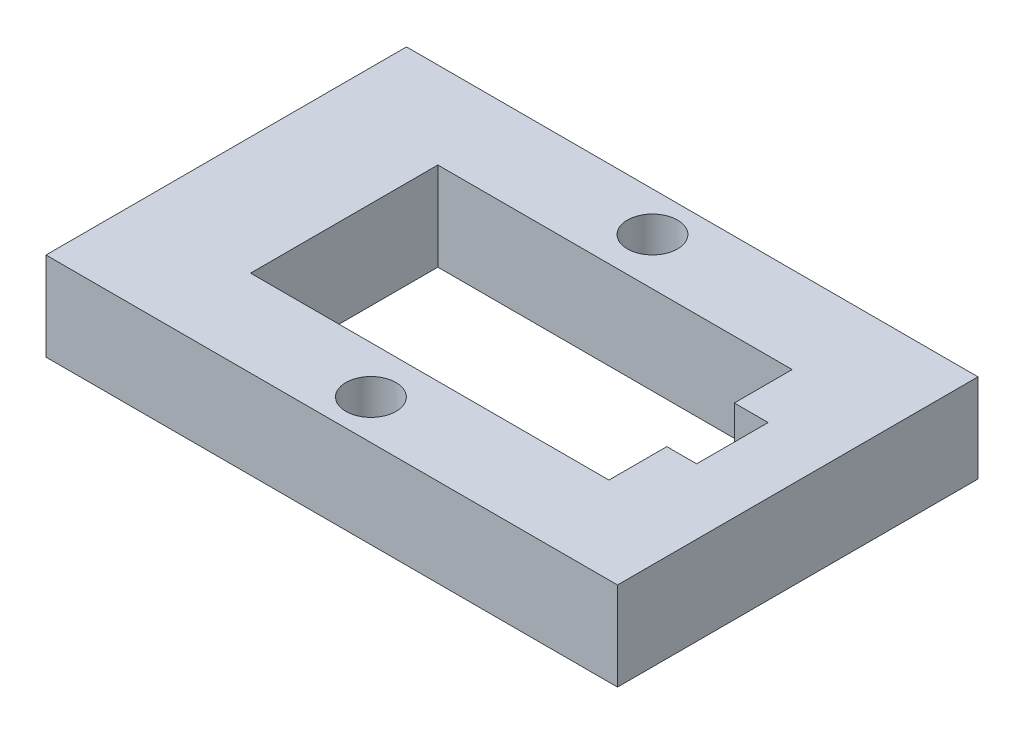
ISO-10303-21;
HEADER;
FILE_DESCRIPTION(('STEP AP214'),'2;1');
FILE_NAME('part.step','',(''),(''),'','','');
FILE_SCHEMA(('AUTOMOTIVE_DESIGN { 1 0 10303 214 1 1 1 1 }'));
ENDSEC;
DATA;
#1=APPLICATION_CONTEXT('core data for automotive mechanical design processes');
#2=APPLICATION_PROTOCOL_DEFINITION('international standard','automotive_design',2000,#1);
#3=PRODUCT_CONTEXT('',#1,'mechanical');
#4=PRODUCT('Part','Part','',(#3));
#5=PRODUCT_RELATED_PRODUCT_CATEGORY('part','',(#4));
#6=PRODUCT_DEFINITION_FORMATION('','',#4);
#7=PRODUCT_DEFINITION_CONTEXT('part definition',#1,'design');
#8=PRODUCT_DEFINITION('design','',#6,#7);
#9=PRODUCT_DEFINITION_SHAPE('','',#8);
#10=(LENGTH_UNIT() NAMED_UNIT(*) SI_UNIT(.MILLI.,.METRE.));
#11=(NAMED_UNIT(*) PLANE_ANGLE_UNIT() SI_UNIT($,.RADIAN.));
#12=(NAMED_UNIT(*) SI_UNIT($,.STERADIAN.) SOLID_ANGLE_UNIT());
#13=UNCERTAINTY_MEASURE_WITH_UNIT(LENGTH_MEASURE(1.E-05),#10,'distance_accuracy_value','');
#14=(GEOMETRIC_REPRESENTATION_CONTEXT(3) GLOBAL_UNCERTAINTY_ASSIGNED_CONTEXT((#13)) GLOBAL_UNIT_ASSIGNED_CONTEXT((#10,
#11,#12)) REPRESENTATION_CONTEXT('',''));
#15=CARTESIAN_POINT('',(0.,0.,0.));
#16=DIRECTION('',(0.,0.,1.));
#17=DIRECTION('',(1.,0.,0.));
#18=AXIS2_PLACEMENT_3D('',#15,#16,#17);
#19=CARTESIAN_POINT('',(0.,3.,0.));
#20=DIRECTION('',(0.,1.,0.));
#21=DIRECTION('',(0.,0.,1.));
#22=AXIS2_PLACEMENT_3D('',#19,#20,#21);
#23=PLANE('',#22);
#24=CARTESIAN_POINT('',(-1.2726821184778,3.,-10.9543613464888));
#25=DIRECTION('',(0.,1.,0.));
#26=DIRECTION('',(0.,0.,1.));
#27=AXIS2_PLACEMENT_3D('',#24,#25,#26);
#28=CIRCLE('',#27,1.7);
#29=CARTESIAN_POINT('',(-1.2726821184778,3.,-9.25436134648878));
#30=VERTEX_POINT('',#29);
#31=EDGE_CURVE('E176',#30,#30,#28,.T.);
#32=ORIENTED_EDGE('',*,*,#31,.F.);
#33=EDGE_LOOP('',(#32));
#34=FACE_BOUND('',#33,.T.);
#35=DIRECTION('',(0.,0.,1.));
#36=VECTOR('',#35,1.);
#37=CARTESIAN_POINT('',(-20.6290016384778,3.,-13.6320813464888));
#38=LINE('',#37,#36);
#39=CARTESIAN_POINT('',(-20.6290016384778,3.,-13.6320813464888));
#40=VERTEX_POINT('',#39);
#41=CARTESIAN_POINT('',(-20.6290016384778,3.,10.8109486535112));
#42=VERTEX_POINT('',#41);
#43=EDGE_CURVE('E220',#40,#42,#38,.T.);
#44=ORIENTED_EDGE('',*,*,#43,.T.);
#45=DIRECTION('',(1.,0.,0.));
#46=VECTOR('',#45,1.);
#47=CARTESIAN_POINT('',(-20.6290016384778,3.,10.8109486535112));
#48=LINE('',#47,#46);
#49=CARTESIAN_POINT('',(18.1229383615222,3.,10.8109486535112));
#50=VERTEX_POINT('',#49);
#51=EDGE_CURVE('E224',#42,#50,#48,.T.);
#52=ORIENTED_EDGE('',*,*,#51,.T.);
#53=DIRECTION('',(0.,0.,-1.));
#54=VECTOR('',#53,1.);
#55=CARTESIAN_POINT('',(18.1229383615222,3.,-13.6320813464888));
#56=LINE('',#55,#54);
#57=CARTESIAN_POINT('',(18.1229383615222,3.,-13.6320813464888));
#58=VERTEX_POINT('',#57);
#59=EDGE_CURVE('E228',#50,#58,#56,.T.);
#60=ORIENTED_EDGE('',*,*,#59,.T.);
#61=DIRECTION('',(-1.,0.,0.));
#62=VECTOR('',#61,1.);
#63=CARTESIAN_POINT('',(-20.6290016384778,3.,-13.6320813464888));
#64=LINE('',#63,#62);
#65=EDGE_CURVE('E231',#58,#40,#64,.T.);
#66=ORIENTED_EDGE('',*,*,#65,.T.);
#67=EDGE_LOOP('',(#44,#52,#60,#66));
#68=FACE_BOUND('',#67,.T.);
#69=DIRECTION('',(1.,0.,0.));
#70=VECTOR('',#69,1.);
#71=CARTESIAN_POINT('',(11.6709983615222,3.,4.94094865351122));
#72=LINE('',#71,#70);
#73=CARTESIAN_POINT('',(-12.6290016384778,3.,4.94094865351122));
#74=VERTEX_POINT('',#73);
#75=CARTESIAN_POINT('',(11.6709983615222,3.,4.94094865351122));
#76=VERTEX_POINT('',#75);
#77=EDGE_CURVE('E137',#74,#76,#72,.T.);
#78=ORIENTED_EDGE('',*,*,#77,.F.);
#79=DIRECTION('',(0.,0.,1.));
#80=VECTOR('',#79,1.);
#81=CARTESIAN_POINT('',(-12.6290016384778,3.,4.94094865351122));
#82=LINE('',#81,#80);
#83=CARTESIAN_POINT('',(-12.6290016384778,3.,-7.75905134648878));
#84=VERTEX_POINT('',#83);
#85=EDGE_CURVE('E128',#84,#74,#82,.T.);
#86=ORIENTED_EDGE('',*,*,#85,.F.);
#87=DIRECTION('',(-1.,0.,0.));
#88=VECTOR('',#87,1.);
#89=CARTESIAN_POINT('',(-12.6290016384778,3.,-7.75905134648878));
#90=LINE('',#89,#88);
#91=CARTESIAN_POINT('',(11.3955588266385,3.,-7.75905134648878));
#92=VERTEX_POINT('',#91);
#93=EDGE_CURVE('E171',#92,#84,#90,.T.);
#94=ORIENTED_EDGE('',*,*,#93,.F.);
#95=DIRECTION('',(0.,0.,-1.));
#96=VECTOR('',#95,1.);
#97=CARTESIAN_POINT('',(11.3955588266385,3.,-7.75905134648878));
#98=LINE('',#97,#96);
#99=CARTESIAN_POINT('',(11.3955588266385,3.,-3.83394634648878));
#100=VERTEX_POINT('',#99);
#101=EDGE_CURVE('E168',#100,#92,#98,.T.);
#102=ORIENTED_EDGE('',*,*,#101,.F.);
#103=DIRECTION('',(-1.,0.,0.));
#104=VECTOR('',#103,1.);
#105=CARTESIAN_POINT('',(11.3955588266385,3.,-3.83394634648878));
#106=LINE('',#105,#104);
#107=CARTESIAN_POINT('',(13.6929483615222,3.,-3.83394634648878));
#108=VERTEX_POINT('',#107);
#109=EDGE_CURVE('E165',#108,#100,#106,.T.);
#110=ORIENTED_EDGE('',*,*,#109,.F.);
#111=DIRECTION('',(0.,0.,-1.));
#112=VECTOR('',#111,1.);
#113=CARTESIAN_POINT('',(13.6929483615222,3.,-3.83394634648878));
#114=LINE('',#113,#112);
#115=CARTESIAN_POINT('',(13.6929483615222,3.,1.01584365351122));
#116=VERTEX_POINT('',#115);
#117=EDGE_CURVE('E162',#116,#108,#114,.T.);
#118=ORIENTED_EDGE('',*,*,#117,.F.);
#119=DIRECTION('',(1.,0.,0.));
#120=VECTOR('',#119,1.);
#121=CARTESIAN_POINT('',(13.6929483615222,3.,1.01584365351122));
#122=LINE('',#121,#120);
#123=CARTESIAN_POINT('',(11.6709983615222,3.,1.01584365351122));
#124=VERTEX_POINT('',#123);
#125=EDGE_CURVE('E156',#124,#116,#122,.T.);
#126=ORIENTED_EDGE('',*,*,#125,.F.);
#127=DIRECTION('',(0.,0.,-1.));
#128=VECTOR('',#127,1.);
#129=CARTESIAN_POINT('',(11.6709983615222,3.,1.01584365351122));
#130=LINE('',#129,#128);
#131=EDGE_CURVE('E152',#76,#124,#130,.T.);
#132=ORIENTED_EDGE('',*,*,#131,.F.);
#133=EDGE_LOOP('',(#78,#86,#94,#102,#110,#118,#126,#132));
#134=FACE_BOUND('',#133,.T.);
#135=CARTESIAN_POINT('',(-1.27706163847779,3.,8.13094865351122));
#136=DIRECTION('',(0.,1.,0.));
#137=DIRECTION('',(0.,0.,1.));
#138=AXIS2_PLACEMENT_3D('',#135,#136,#137);
#139=CIRCLE('',#138,1.7);
#140=CARTESIAN_POINT('',(-1.27706163847779,3.,9.83094865351122));
#141=VERTEX_POINT('',#140);
#142=EDGE_CURVE('E337',#141,#141,#139,.T.);
#143=ORIENTED_EDGE('',*,*,#142,.F.);
#144=EDGE_LOOP('',(#143));
#145=FACE_BOUND('',#144,.T.);
#146=ADVANCED_FACE('F38',(#34,#68,#134,#145),#23,.T.);
#147=CARTESIAN_POINT('',(0.,-3.,0.));
#148=DIRECTION('',(0.,1.,0.));
#149=DIRECTION('',(0.,0.,1.));
#150=AXIS2_PLACEMENT_3D('',#147,#148,#149);
#151=PLANE('',#150);
#152=DIRECTION('',(0.,0.,1.));
#153=VECTOR('',#152,1.);
#154=CARTESIAN_POINT('',(-20.6290016384778,-3.,-13.6320813464888));
#155=LINE('',#154,#153);
#156=CARTESIAN_POINT('',(-20.6290016384778,-3.,-13.6320813464888));
#157=VERTEX_POINT('',#156);
#158=CARTESIAN_POINT('',(-20.6290016384778,-3.,10.8109486535112));
#159=VERTEX_POINT('',#158);
#160=EDGE_CURVE('E146',#157,#159,#155,.T.);
#161=ORIENTED_EDGE('',*,*,#160,.F.);
#162=DIRECTION('',(-1.,0.,0.));
#163=VECTOR('',#162,1.);
#164=CARTESIAN_POINT('',(-20.6290016384778,-3.,-13.6320813464888));
#165=LINE('',#164,#163);
#166=CARTESIAN_POINT('',(18.1229383615222,-3.,-13.6320813464888));
#167=VERTEX_POINT('',#166);
#168=EDGE_CURVE('E225',#167,#157,#165,.T.);
#169=ORIENTED_EDGE('',*,*,#168,.F.);
#170=DIRECTION('',(0.,0.,-1.));
#171=VECTOR('',#170,1.);
#172=CARTESIAN_POINT('',(18.1229383615222,-3.,-13.6320813464888));
#173=LINE('',#172,#171);
#174=CARTESIAN_POINT('',(18.1229383615222,-3.,10.8109486535112));
#175=VERTEX_POINT('',#174);
#176=EDGE_CURVE('E241',#175,#167,#173,.T.);
#177=ORIENTED_EDGE('',*,*,#176,.F.);
#178=DIRECTION('',(1.,0.,0.));
#179=VECTOR('',#178,1.);
#180=CARTESIAN_POINT('',(-20.6290016384778,-3.,10.8109486535112));
#181=LINE('',#180,#179);
#182=EDGE_CURVE('E238',#159,#175,#181,.T.);
#183=ORIENTED_EDGE('',*,*,#182,.F.);
#184=EDGE_LOOP('',(#161,#169,#177,#183));
#185=FACE_BOUND('',#184,.T.);
#186=DIRECTION('',(0.,0.,1.));
#187=VECTOR('',#186,1.);
#188=CARTESIAN_POINT('',(-12.6290016384778,-3.,4.94094865351122));
#189=LINE('',#188,#187);
#190=CARTESIAN_POINT('',(-12.6290016384778,-3.,-7.75905134648878));
#191=VERTEX_POINT('',#190);
#192=CARTESIAN_POINT('',(-12.6290016384778,-3.,4.94094865351122));
#193=VERTEX_POINT('',#192);
#194=EDGE_CURVE('E62',#191,#193,#189,.T.);
#195=ORIENTED_EDGE('',*,*,#194,.T.);
#196=DIRECTION('',(1.,0.,0.));
#197=VECTOR('',#196,1.);
#198=CARTESIAN_POINT('',(11.6709983615222,-3.,4.94094865351122));
#199=LINE('',#198,#197);
#200=CARTESIAN_POINT('',(11.6709983615222,-3.,4.94094865351122));
#201=VERTEX_POINT('',#200);
#202=EDGE_CURVE('E144',#193,#201,#199,.T.);
#203=ORIENTED_EDGE('',*,*,#202,.T.);
#204=DIRECTION('',(0.,0.,-1.));
#205=VECTOR('',#204,1.);
#206=CARTESIAN_POINT('',(11.6709983615222,-3.,1.01584365351122));
#207=LINE('',#206,#205);
#208=CARTESIAN_POINT('',(11.6709983615222,-3.,1.01584365351122));
#209=VERTEX_POINT('',#208);
#210=EDGE_CURVE('E179',#201,#209,#207,.T.);
#211=ORIENTED_EDGE('',*,*,#210,.T.);
#212=DIRECTION('',(1.,0.,0.));
#213=VECTOR('',#212,1.);
#214=CARTESIAN_POINT('',(13.6929483615222,-3.,1.01584365351122));
#215=LINE('',#214,#213);
#216=CARTESIAN_POINT('',(13.6929483615222,-3.,1.01584365351122));
#217=VERTEX_POINT('',#216);
#218=EDGE_CURVE('E183',#209,#217,#215,.T.);
#219=ORIENTED_EDGE('',*,*,#218,.T.);
#220=DIRECTION('',(0.,0.,-1.));
#221=VECTOR('',#220,1.);
#222=CARTESIAN_POINT('',(13.6929483615222,-3.,-3.83394634648878));
#223=LINE('',#222,#221);
#224=CARTESIAN_POINT('',(13.6929483615222,-3.,-3.83394634648878));
#225=VERTEX_POINT('',#224);
#226=EDGE_CURVE('E187',#217,#225,#223,.T.);
#227=ORIENTED_EDGE('',*,*,#226,.T.);
#228=DIRECTION('',(-1.,0.,0.));
#229=VECTOR('',#228,1.);
#230=CARTESIAN_POINT('',(11.3955588266385,-3.,-3.83394634648878));
#231=LINE('',#230,#229);
#232=CARTESIAN_POINT('',(11.3955588266385,-3.,-3.83394634648878));
#233=VERTEX_POINT('',#232);
#234=EDGE_CURVE('E191',#225,#233,#231,.T.);
#235=ORIENTED_EDGE('',*,*,#234,.T.);
#236=DIRECTION('',(0.,0.,-1.));
#237=VECTOR('',#236,1.);
#238=CARTESIAN_POINT('',(11.3955588266385,-3.,-7.75905134648878));
#239=LINE('',#238,#237);
#240=CARTESIAN_POINT('',(11.3955588266385,-3.,-7.75905134648878));
#241=VERTEX_POINT('',#240);
#242=EDGE_CURVE('E195',#233,#241,#239,.T.);
#243=ORIENTED_EDGE('',*,*,#242,.T.);
#244=DIRECTION('',(-1.,0.,0.));
#245=VECTOR('',#244,1.);
#246=CARTESIAN_POINT('',(-12.6290016384778,-3.,-7.75905134648878));
#247=LINE('',#246,#245);
#248=EDGE_CURVE('E138',#241,#191,#247,.T.);
#249=ORIENTED_EDGE('',*,*,#248,.T.);
#250=EDGE_LOOP('',(#195,#203,#211,#219,#227,#235,#243,#249));
#251=FACE_BOUND('',#250,.T.);
#252=CARTESIAN_POINT('',(-1.2726821184778,-3.,-10.9543613464888));
#253=DIRECTION('',(0.,1.,0.));
#254=DIRECTION('',(0.,0.,1.));
#255=AXIS2_PLACEMENT_3D('',#252,#253,#254);
#256=CIRCLE('',#255,1.7);
#257=CARTESIAN_POINT('',(-1.2726821184778,-3.,-9.25436134648878));
#258=VERTEX_POINT('',#257);
#259=EDGE_CURVE('E345',#258,#258,#256,.T.);
#260=ORIENTED_EDGE('',*,*,#259,.T.);
#261=EDGE_LOOP('',(#260));
#262=FACE_BOUND('',#261,.T.);
#263=CARTESIAN_POINT('',(-1.27706163847779,-3.,8.13094865351122));
#264=DIRECTION('',(0.,1.,0.));
#265=DIRECTION('',(0.,0.,1.));
#266=AXIS2_PLACEMENT_3D('',#263,#264,#265);
#267=CIRCLE('',#266,1.7);
#268=CARTESIAN_POINT('',(-1.27706163847779,-3.,9.83094865351122));
#269=VERTEX_POINT('',#268);
#270=EDGE_CURVE('E340',#269,#269,#267,.T.);
#271=ORIENTED_EDGE('',*,*,#270,.T.);
#272=EDGE_LOOP('',(#271));
#273=FACE_BOUND('',#272,.T.);
#274=ADVANCED_FACE('F264',(#185,#251,#262,#273),#151,.F.);
#275=CARTESIAN_POINT('',(-20.6290016384778,3.,-13.6320813464888));
#276=DIRECTION('',(1.,0.,0.));
#277=DIRECTION('',(0.,0.,-1.));
#278=AXIS2_PLACEMENT_3D('',#275,#276,#277);
#279=PLANE('',#278);
#280=ORIENTED_EDGE('',*,*,#160,.T.);
#281=DIRECTION('',(0.,-1.,0.));
#282=VECTOR('',#281,1.);
#283=CARTESIAN_POINT('',(-20.6290016384778,3.,10.8109486535112));
#284=LINE('',#283,#282);
#285=EDGE_CURVE('E11',#42,#159,#284,.T.);
#286=ORIENTED_EDGE('',*,*,#285,.F.);
#287=ORIENTED_EDGE('',*,*,#43,.F.);
#288=DIRECTION('',(0.,-1.,0.));
#289=VECTOR('',#288,1.);
#290=CARTESIAN_POINT('',(-20.6290016384778,3.,-13.6320813464888));
#291=LINE('',#290,#289);
#292=EDGE_CURVE('E234',#40,#157,#291,.T.);
#293=ORIENTED_EDGE('',*,*,#292,.T.);
#294=EDGE_LOOP('',(#280,#286,#287,#293));
#295=FACE_BOUND('',#294,.T.);
#296=ADVANCED_FACE('F40',(#295),#279,.F.);
#297=CARTESIAN_POINT('',(-20.6290016384778,3.,10.8109486535112));
#298=DIRECTION('',(0.,0.,-1.));
#299=DIRECTION('',(-1.,0.,0.));
#300=AXIS2_PLACEMENT_3D('',#297,#298,#299);
#301=PLANE('',#300);
#302=ORIENTED_EDGE('',*,*,#182,.T.);
#303=DIRECTION('',(0.,-1.,0.));
#304=VECTOR('',#303,1.);
#305=CARTESIAN_POINT('',(18.1229383615222,3.,10.8109486535112));
#306=LINE('',#305,#304);
#307=EDGE_CURVE('E47',#50,#175,#306,.T.);
#308=ORIENTED_EDGE('',*,*,#307,.F.);
#309=ORIENTED_EDGE('',*,*,#51,.F.);
#310=ORIENTED_EDGE('',*,*,#285,.T.);
#311=EDGE_LOOP('',(#302,#308,#309,#310));
#312=FACE_BOUND('',#311,.T.);
#313=ADVANCED_FACE('F274',(#312),#301,.F.);
#314=CARTESIAN_POINT('',(18.1229383615222,3.,-13.6320813464888));
#315=DIRECTION('',(-1.,0.,0.));
#316=DIRECTION('',(0.,0.,1.));
#317=AXIS2_PLACEMENT_3D('',#314,#315,#316);
#318=PLANE('',#317);
#319=ORIENTED_EDGE('',*,*,#176,.T.);
#320=DIRECTION('',(0.,-1.,0.));
#321=VECTOR('',#320,1.);
#322=CARTESIAN_POINT('',(18.1229383615222,3.,-13.6320813464888));
#323=LINE('',#322,#321);
#324=EDGE_CURVE('E249',#58,#167,#323,.T.);
#325=ORIENTED_EDGE('',*,*,#324,.F.);
#326=ORIENTED_EDGE('',*,*,#59,.F.);
#327=ORIENTED_EDGE('',*,*,#307,.T.);
#328=EDGE_LOOP('',(#319,#325,#326,#327));
#329=FACE_BOUND('',#328,.T.);
#330=ADVANCED_FACE('F258',(#329),#318,.F.);
#331=CARTESIAN_POINT('',(-20.6290016384778,3.,-13.6320813464888));
#332=DIRECTION('',(0.,0.,1.));
#333=DIRECTION('',(1.,0.,0.));
#334=AXIS2_PLACEMENT_3D('',#331,#332,#333);
#335=PLANE('',#334);
#336=ORIENTED_EDGE('',*,*,#168,.T.);
#337=ORIENTED_EDGE('',*,*,#292,.F.);
#338=ORIENTED_EDGE('',*,*,#65,.F.);
#339=ORIENTED_EDGE('',*,*,#324,.T.);
#340=EDGE_LOOP('',(#336,#337,#338,#339));
#341=FACE_BOUND('',#340,.T.);
#342=ADVANCED_FACE('F268',(#341),#335,.F.);
#343=CARTESIAN_POINT('',(-12.6290016384778,3.,4.94094865351122));
#344=DIRECTION('',(1.,0.,0.));
#345=DIRECTION('',(0.,0.,-1.));
#346=AXIS2_PLACEMENT_3D('',#343,#344,#345);
#347=PLANE('',#346);
#348=ORIENTED_EDGE('',*,*,#194,.F.);
#349=DIRECTION('',(0.,-1.,0.));
#350=VECTOR('',#349,1.);
#351=CARTESIAN_POINT('',(-12.6290016384778,3.,-7.75905134648878));
#352=LINE('',#351,#350);
#353=EDGE_CURVE('E132',#84,#191,#352,.T.);
#354=ORIENTED_EDGE('',*,*,#353,.F.);
#355=ORIENTED_EDGE('',*,*,#85,.T.);
#356=DIRECTION('',(0.,-1.,0.));
#357=VECTOR('',#356,1.);
#358=CARTESIAN_POINT('',(-12.6290016384778,3.,4.94094865351122));
#359=LINE('',#358,#357);
#360=EDGE_CURVE('E131',#74,#193,#359,.T.);
#361=ORIENTED_EDGE('',*,*,#360,.T.);
#362=EDGE_LOOP('',(#348,#354,#355,#361));
#363=FACE_BOUND('',#362,.T.);
#364=ADVANCED_FACE('F130',(#363),#347,.T.);
#365=CARTESIAN_POINT('',(11.6709983615222,3.,4.94094865351122));
#366=DIRECTION('',(0.,0.,-1.));
#367=DIRECTION('',(-1.,0.,0.));
#368=AXIS2_PLACEMENT_3D('',#365,#366,#367);
#369=PLANE('',#368);
#370=ORIENTED_EDGE('',*,*,#202,.F.);
#371=ORIENTED_EDGE('',*,*,#360,.F.);
#372=ORIENTED_EDGE('',*,*,#77,.T.);
#373=DIRECTION('',(0.,-1.,0.));
#374=VECTOR('',#373,1.);
#375=CARTESIAN_POINT('',(11.6709983615222,3.,4.94094865351122));
#376=LINE('',#375,#374);
#377=EDGE_CURVE('E147',#76,#201,#376,.T.);
#378=ORIENTED_EDGE('',*,*,#377,.T.);
#379=EDGE_LOOP('',(#370,#371,#372,#378));
#380=FACE_BOUND('',#379,.T.);
#381=ADVANCED_FACE('F141',(#380),#369,.T.);
#382=CARTESIAN_POINT('',(11.6709983615222,3.,1.01584365351122));
#383=DIRECTION('',(-1.,0.,0.));
#384=DIRECTION('',(0.,0.,1.));
#385=AXIS2_PLACEMENT_3D('',#382,#383,#384);
#386=PLANE('',#385);
#387=ORIENTED_EDGE('',*,*,#210,.F.);
#388=ORIENTED_EDGE('',*,*,#377,.F.);
#389=ORIENTED_EDGE('',*,*,#131,.T.);
#390=DIRECTION('',(0.,-1.,0.));
#391=VECTOR('',#390,1.);
#392=CARTESIAN_POINT('',(11.6709983615222,3.,1.01584365351122));
#393=LINE('',#392,#391);
#394=EDGE_CURVE('E215',#124,#209,#393,.T.);
#395=ORIENTED_EDGE('',*,*,#394,.T.);
#396=EDGE_LOOP('',(#387,#388,#389,#395));
#397=FACE_BOUND('',#396,.T.);
#398=ADVANCED_FACE('F299',(#397),#386,.T.);
#399=CARTESIAN_POINT('',(13.6929483615222,3.,1.01584365351122));
#400=DIRECTION('',(0.,0.,-1.));
#401=DIRECTION('',(-1.,0.,0.));
#402=AXIS2_PLACEMENT_3D('',#399,#400,#401);
#403=PLANE('',#402);
#404=ORIENTED_EDGE('',*,*,#218,.F.);
#405=ORIENTED_EDGE('',*,*,#394,.F.);
#406=ORIENTED_EDGE('',*,*,#125,.T.);
#407=DIRECTION('',(0.,-1.,0.));
#408=VECTOR('',#407,1.);
#409=CARTESIAN_POINT('',(13.6929483615222,3.,1.01584365351122));
#410=LINE('',#409,#408);
#411=EDGE_CURVE('E212',#116,#217,#410,.T.);
#412=ORIENTED_EDGE('',*,*,#411,.T.);
#413=EDGE_LOOP('',(#404,#405,#406,#412));
#414=FACE_BOUND('',#413,.T.);
#415=ADVANCED_FACE('F303',(#414),#403,.T.);
#416=CARTESIAN_POINT('',(13.6929483615222,3.,-3.83394634648878));
#417=DIRECTION('',(-1.,0.,0.));
#418=DIRECTION('',(0.,0.,1.));
#419=AXIS2_PLACEMENT_3D('',#416,#417,#418);
#420=PLANE('',#419);
#421=ORIENTED_EDGE('',*,*,#226,.F.);
#422=ORIENTED_EDGE('',*,*,#411,.F.);
#423=ORIENTED_EDGE('',*,*,#117,.T.);
#424=DIRECTION('',(0.,-1.,0.));
#425=VECTOR('',#424,1.);
#426=CARTESIAN_POINT('',(13.6929483615222,3.,-3.83394634648878));
#427=LINE('',#426,#425);
#428=EDGE_CURVE('E209',#108,#225,#427,.T.);
#429=ORIENTED_EDGE('',*,*,#428,.T.);
#430=EDGE_LOOP('',(#421,#422,#423,#429));
#431=FACE_BOUND('',#430,.T.);
#432=ADVANCED_FACE('F309',(#431),#420,.T.);
#433=CARTESIAN_POINT('',(11.3955588266385,3.,-3.83394634648878));
#434=DIRECTION('',(0.,0.,1.));
#435=DIRECTION('',(1.,0.,0.));
#436=AXIS2_PLACEMENT_3D('',#433,#434,#435);
#437=PLANE('',#436);
#438=ORIENTED_EDGE('',*,*,#234,.F.);
#439=ORIENTED_EDGE('',*,*,#428,.F.);
#440=ORIENTED_EDGE('',*,*,#109,.T.);
#441=DIRECTION('',(0.,-1.,0.));
#442=VECTOR('',#441,1.);
#443=CARTESIAN_POINT('',(11.3955588266385,3.,-3.83394634648878));
#444=LINE('',#443,#442);
#445=EDGE_CURVE('E206',#100,#233,#444,.T.);
#446=ORIENTED_EDGE('',*,*,#445,.T.);
#447=EDGE_LOOP('',(#438,#439,#440,#446));
#448=FACE_BOUND('',#447,.T.);
#449=ADVANCED_FACE('F313',(#448),#437,.T.);
#450=CARTESIAN_POINT('',(11.3955588266385,3.,-7.75905134648878));
#451=DIRECTION('',(-1.,0.,0.));
#452=DIRECTION('',(0.,0.,1.));
#453=AXIS2_PLACEMENT_3D('',#450,#451,#452);
#454=PLANE('',#453);
#455=ORIENTED_EDGE('',*,*,#242,.F.);
#456=ORIENTED_EDGE('',*,*,#445,.F.);
#457=ORIENTED_EDGE('',*,*,#101,.T.);
#458=DIRECTION('',(0.,-1.,0.));
#459=VECTOR('',#458,1.);
#460=CARTESIAN_POINT('',(11.3955588266385,3.,-7.75905134648878));
#461=LINE('',#460,#459);
#462=EDGE_CURVE('E54',#92,#241,#461,.T.);
#463=ORIENTED_EDGE('',*,*,#462,.T.);
#464=EDGE_LOOP('',(#455,#456,#457,#463));
#465=FACE_BOUND('',#464,.T.);
#466=ADVANCED_FACE('F317',(#465),#454,.T.);
#467=CARTESIAN_POINT('',(-12.6290016384778,3.,-7.75905134648878));
#468=DIRECTION('',(0.,0.,1.));
#469=DIRECTION('',(1.,0.,0.));
#470=AXIS2_PLACEMENT_3D('',#467,#468,#469);
#471=PLANE('',#470);
#472=ORIENTED_EDGE('',*,*,#248,.F.);
#473=ORIENTED_EDGE('',*,*,#462,.F.);
#474=ORIENTED_EDGE('',*,*,#93,.T.);
#475=ORIENTED_EDGE('',*,*,#353,.T.);
#476=EDGE_LOOP('',(#472,#473,#474,#475));
#477=FACE_BOUND('',#476,.T.);
#478=ADVANCED_FACE('F321',(#477),#471,.T.);
#479=CARTESIAN_POINT('',(-1.2726821184778,3.,-10.9543613464888));
#480=DIRECTION('',(0.,-1.,0.));
#481=DIRECTION('',(0.,0.,-1.));
#482=AXIS2_PLACEMENT_3D('',#479,#480,#481);
#483=CYLINDRICAL_SURFACE('',#482,1.7);
#484=ORIENTED_EDGE('',*,*,#31,.T.);
#485=EDGE_LOOP('',(#484));
#486=FACE_BOUND('',#485,.T.);
#487=ORIENTED_EDGE('',*,*,#259,.F.);
#488=EDGE_LOOP('',(#487));
#489=FACE_BOUND('',#488,.T.);
#490=ADVANCED_FACE('F325',(#486,#489),#483,.F.);
#491=CARTESIAN_POINT('',(-1.27706163847779,3.,8.13094865351122));
#492=DIRECTION('',(0.,-1.,0.));
#493=DIRECTION('',(0.,0.,-1.));
#494=AXIS2_PLACEMENT_3D('',#491,#492,#493);
#495=CYLINDRICAL_SURFACE('',#494,1.7);
#496=ORIENTED_EDGE('',*,*,#142,.T.);
#497=EDGE_LOOP('',(#496));
#498=FACE_BOUND('',#497,.T.);
#499=ORIENTED_EDGE('',*,*,#270,.F.);
#500=EDGE_LOOP('',(#499));
#501=FACE_BOUND('',#500,.T.);
#502=ADVANCED_FACE('F328',(#498,#501),#495,.F.);
#503=CLOSED_SHELL('',(#146,#274,#296,#313,#330,#342,#364,#381,#398,#415,#432,#449,#466,#478,
#490,#502));
#504=MANIFOLD_SOLID_BREP('B2',#503);
#505=ADVANCED_BREP_SHAPE_REPRESENTATION('',(#18,#504),#14);
#506=SHAPE_DEFINITION_REPRESENTATION(#9,#505);
ENDSEC;
END-ISO-10303-21;
